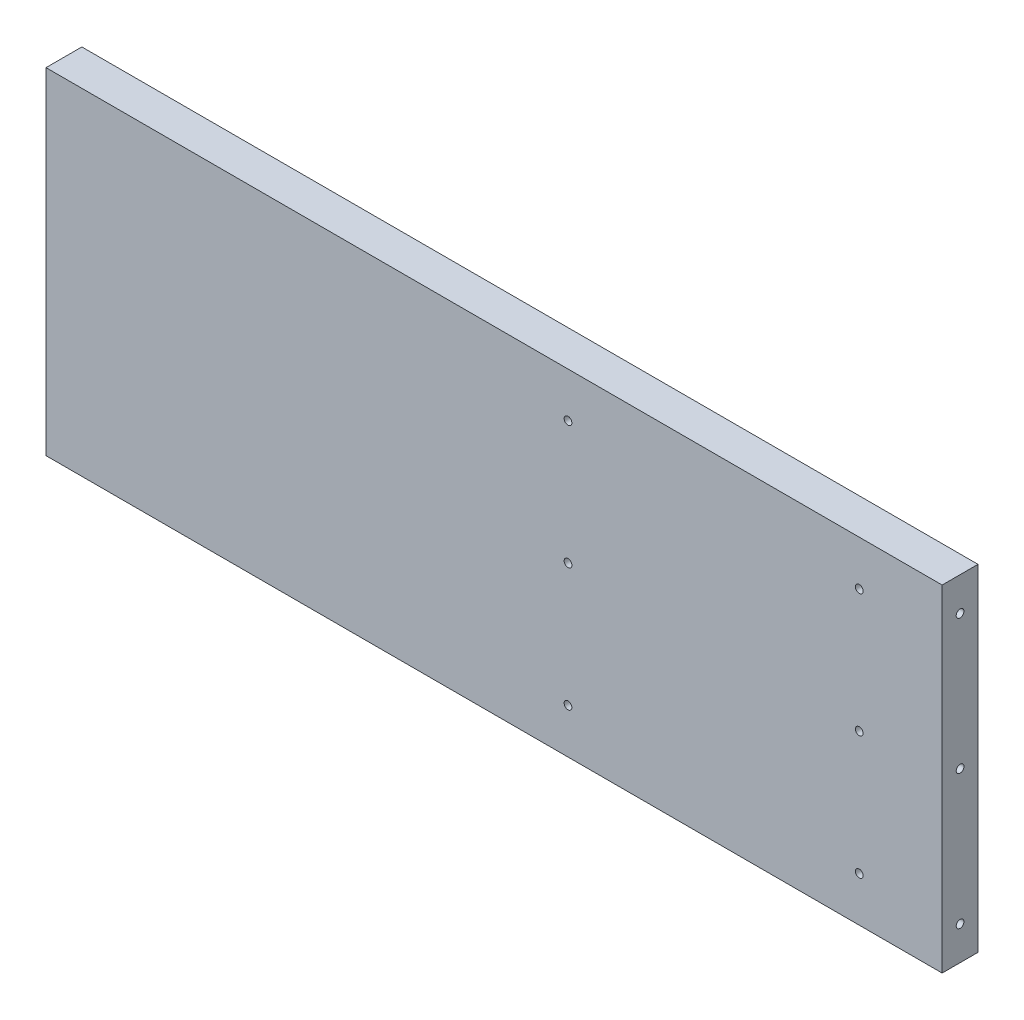
ISO-10303-21;
HEADER;
FILE_DESCRIPTION(('STEP AP214'),'2;1');
FILE_NAME('part.step','',(''),(''),'','','');
FILE_SCHEMA(('AUTOMOTIVE_DESIGN { 1 0 10303 214 1 1 1 1 }'));
ENDSEC;
DATA;
#1=APPLICATION_CONTEXT('core data for automotive mechanical design processes');
#2=APPLICATION_PROTOCOL_DEFINITION('international standard','automotive_design',2000,#1);
#3=PRODUCT_CONTEXT('',#1,'mechanical');
#4=PRODUCT('Part','Part','',(#3));
#5=PRODUCT_RELATED_PRODUCT_CATEGORY('part','',(#4));
#6=PRODUCT_DEFINITION_FORMATION('','',#4);
#7=PRODUCT_DEFINITION_CONTEXT('part definition',#1,'design');
#8=PRODUCT_DEFINITION('design','',#6,#7);
#9=PRODUCT_DEFINITION_SHAPE('','',#8);
#10=(LENGTH_UNIT() NAMED_UNIT(*) SI_UNIT(.MILLI.,.METRE.));
#11=(NAMED_UNIT(*) PLANE_ANGLE_UNIT() SI_UNIT($,.RADIAN.));
#12=(NAMED_UNIT(*) SI_UNIT($,.STERADIAN.) SOLID_ANGLE_UNIT());
#13=UNCERTAINTY_MEASURE_WITH_UNIT(LENGTH_MEASURE(1.E-05),#10,'distance_accuracy_value','');
#14=(GEOMETRIC_REPRESENTATION_CONTEXT(3) GLOBAL_UNCERTAINTY_ASSIGNED_CONTEXT((#13)) GLOBAL_UNIT_ASSIGNED_CONTEXT((#10,
#11,#12)) REPRESENTATION_CONTEXT('',''));
#15=CARTESIAN_POINT('',(0.,0.,0.));
#16=DIRECTION('',(0.,0.,1.));
#17=DIRECTION('',(1.,0.,0.));
#18=AXIS2_PLACEMENT_3D('',#15,#16,#17);
#19=CARTESIAN_POINT('',(200.,-75.,8.));
#20=DIRECTION('',(-1.,0.,0.));
#21=DIRECTION('',(0.,0.,1.));
#22=AXIS2_PLACEMENT_3D('',#19,#20,#21);
#23=PLANE('',#22);
#24=CARTESIAN_POINT('',(200.,60.,0.));
#25=DIRECTION('',(1.,0.,0.));
#26=DIRECTION('',(0.,0.,-1.));
#27=AXIS2_PLACEMENT_3D('',#24,#25,#26);
#28=CIRCLE('',#27,1.7272);
#29=CARTESIAN_POINT('',(200.,60.,-1.72720000000005));
#30=VERTEX_POINT('',#29);
#31=EDGE_CURVE('E162',#30,#30,#28,.T.);
#32=ORIENTED_EDGE('',*,*,#31,.F.);
#33=EDGE_LOOP('',(#32));
#34=FACE_BOUND('',#33,.T.);
#35=CARTESIAN_POINT('',(200.,0.,0.));
#36=DIRECTION('',(1.,0.,0.));
#37=DIRECTION('',(0.,0.,-1.));
#38=AXIS2_PLACEMENT_3D('',#35,#36,#37);
#39=CIRCLE('',#38,1.7272);
#40=CARTESIAN_POINT('',(200.,0.,-1.7272));
#41=VERTEX_POINT('',#40);
#42=EDGE_CURVE('E170',#41,#41,#39,.T.);
#43=ORIENTED_EDGE('',*,*,#42,.F.);
#44=EDGE_LOOP('',(#43));
#45=FACE_BOUND('',#44,.T.);
#46=CARTESIAN_POINT('',(200.,-59.9999999999998,0.));
#47=DIRECTION('',(1.,0.,0.));
#48=DIRECTION('',(0.,0.,-1.));
#49=AXIS2_PLACEMENT_3D('',#46,#47,#48);
#50=CIRCLE('',#49,1.7272);
#51=CARTESIAN_POINT('',(200.,-59.9999999999998,-1.72720000000005));
#52=VERTEX_POINT('',#51);
#53=EDGE_CURVE('E178',#52,#52,#50,.T.);
#54=ORIENTED_EDGE('',*,*,#53,.F.);
#55=EDGE_LOOP('',(#54));
#56=FACE_BOUND('',#55,.T.);
#57=DIRECTION('',(0.,1.,0.));
#58=VECTOR('',#57,1.);
#59=CARTESIAN_POINT('',(200.,-75.,-8.));
#60=LINE('',#59,#58);
#61=CARTESIAN_POINT('',(200.,-75.,-8.));
#62=VERTEX_POINT('',#61);
#63=CARTESIAN_POINT('',(200.,75.,-8.));
#64=VERTEX_POINT('',#63);
#65=EDGE_CURVE('E230',#62,#64,#60,.T.);
#66=ORIENTED_EDGE('',*,*,#65,.T.);
#67=DIRECTION('',(0.,0.,-1.));
#68=VECTOR('',#67,1.);
#69=CARTESIAN_POINT('',(200.,75.,8.));
#70=LINE('',#69,#68);
#71=CARTESIAN_POINT('',(200.,75.,8.));
#72=VERTEX_POINT('',#71);
#73=EDGE_CURVE('E11',#72,#64,#70,.T.);
#74=ORIENTED_EDGE('',*,*,#73,.F.);
#75=DIRECTION('',(0.,1.,0.));
#76=VECTOR('',#75,1.);
#77=CARTESIAN_POINT('',(200.,-75.,8.));
#78=LINE('',#77,#76);
#79=CARTESIAN_POINT('',(200.,-75.,8.));
#80=VERTEX_POINT('',#79);
#81=EDGE_CURVE('E231',#80,#72,#78,.T.);
#82=ORIENTED_EDGE('',*,*,#81,.F.);
#83=DIRECTION('',(0.,0.,-1.));
#84=VECTOR('',#83,1.);
#85=CARTESIAN_POINT('',(200.,-75.,8.));
#86=LINE('',#85,#84);
#87=EDGE_CURVE('E241',#80,#62,#86,.T.);
#88=ORIENTED_EDGE('',*,*,#87,.T.);
#89=EDGE_LOOP('',(#66,#74,#82,#88));
#90=FACE_BOUND('',#89,.T.);
#91=ADVANCED_FACE('F49',(#34,#45,#56,#90),#23,.F.);
#92=CARTESIAN_POINT('',(-200.,75.,8.));
#93=DIRECTION('',(0.,-1.,0.));
#94=DIRECTION('',(0.,0.,-1.));
#95=AXIS2_PLACEMENT_3D('',#92,#93,#94);
#96=PLANE('',#95);
#97=DIRECTION('',(-1.,0.,0.));
#98=VECTOR('',#97,1.);
#99=CARTESIAN_POINT('',(-200.,75.,-8.));
#100=LINE('',#99,#98);
#101=CARTESIAN_POINT('',(-200.,75.,-8.));
#102=VERTEX_POINT('',#101);
#103=EDGE_CURVE('E245',#64,#102,#100,.T.);
#104=ORIENTED_EDGE('',*,*,#103,.T.);
#105=DIRECTION('',(0.,0.,-1.));
#106=VECTOR('',#105,1.);
#107=CARTESIAN_POINT('',(-200.,75.,8.));
#108=LINE('',#107,#106);
#109=CARTESIAN_POINT('',(-200.,75.,8.));
#110=VERTEX_POINT('',#109);
#111=EDGE_CURVE('E59',#110,#102,#108,.T.);
#112=ORIENTED_EDGE('',*,*,#111,.F.);
#113=DIRECTION('',(-1.,0.,0.));
#114=VECTOR('',#113,1.);
#115=CARTESIAN_POINT('',(-200.,75.,8.));
#116=LINE('',#115,#114);
#117=EDGE_CURVE('E98',#72,#110,#116,.T.);
#118=ORIENTED_EDGE('',*,*,#117,.F.);
#119=ORIENTED_EDGE('',*,*,#73,.T.);
#120=EDGE_LOOP('',(#104,#112,#118,#119));
#121=FACE_BOUND('',#120,.T.);
#122=ADVANCED_FACE('F280',(#121),#96,.F.);
#123=CARTESIAN_POINT('',(-200.,-75.,8.));
#124=DIRECTION('',(1.,0.,0.));
#125=DIRECTION('',(0.,0.,-1.));
#126=AXIS2_PLACEMENT_3D('',#123,#124,#125);
#127=PLANE('',#126);
#128=DIRECTION('',(0.,-1.,0.));
#129=VECTOR('',#128,1.);
#130=CARTESIAN_POINT('',(-200.,-75.,-8.));
#131=LINE('',#130,#129);
#132=CARTESIAN_POINT('',(-200.,-75.,-8.));
#133=VERTEX_POINT('',#132);
#134=EDGE_CURVE('E85',#102,#133,#131,.T.);
#135=ORIENTED_EDGE('',*,*,#134,.T.);
#136=DIRECTION('',(0.,0.,-1.));
#137=VECTOR('',#136,1.);
#138=CARTESIAN_POINT('',(-200.,-75.,8.));
#139=LINE('',#138,#137);
#140=CARTESIAN_POINT('',(-200.,-75.,8.));
#141=VERTEX_POINT('',#140);
#142=EDGE_CURVE('E254',#141,#133,#139,.T.);
#143=ORIENTED_EDGE('',*,*,#142,.F.);
#144=DIRECTION('',(0.,-1.,0.));
#145=VECTOR('',#144,1.);
#146=CARTESIAN_POINT('',(-200.,-75.,8.));
#147=LINE('',#146,#145);
#148=EDGE_CURVE('E236',#110,#141,#147,.T.);
#149=ORIENTED_EDGE('',*,*,#148,.F.);
#150=ORIENTED_EDGE('',*,*,#111,.T.);
#151=EDGE_LOOP('',(#135,#143,#149,#150));
#152=FACE_BOUND('',#151,.T.);
#153=ADVANCED_FACE('F260',(#152),#127,.F.);
#154=CARTESIAN_POINT('',(-200.,-75.,8.));
#155=DIRECTION('',(0.,1.,0.));
#156=DIRECTION('',(0.,0.,1.));
#157=AXIS2_PLACEMENT_3D('',#154,#155,#156);
#158=PLANE('',#157);
#159=CARTESIAN_POINT('',(87.9999999999998,-75.,0.));
#160=DIRECTION('',(0.,-1.,0.));
#161=DIRECTION('',(0.,0.,-1.));
#162=AXIS2_PLACEMENT_3D('',#159,#160,#161);
#163=CIRCLE('',#162,1.72719999999998);
#164=CARTESIAN_POINT('',(87.9999999999998,-75.,-1.72719999999996));
#165=VERTEX_POINT('',#164);
#166=EDGE_CURVE('E132',#165,#165,#163,.T.);
#167=ORIENTED_EDGE('',*,*,#166,.F.);
#168=EDGE_LOOP('',(#167));
#169=FACE_BOUND('',#168,.T.);
#170=CARTESIAN_POINT('',(112.,-75.,0.));
#171=DIRECTION('',(0.,-1.,0.));
#172=DIRECTION('',(0.,0.,-1.));
#173=AXIS2_PLACEMENT_3D('',#170,#171,#172);
#174=CIRCLE('',#173,1.72719999999998);
#175=CARTESIAN_POINT('',(112.,-75.,-1.72719999999995));
#176=VERTEX_POINT('',#175);
#177=EDGE_CURVE('E131',#176,#176,#174,.T.);
#178=ORIENTED_EDGE('',*,*,#177,.F.);
#179=EDGE_LOOP('',(#178));
#180=FACE_BOUND('',#179,.T.);
#181=CARTESIAN_POINT('',(-88.0000000000002,-75.,0.));
#182=DIRECTION('',(0.,-1.,0.));
#183=DIRECTION('',(0.,0.,-1.));
#184=AXIS2_PLACEMENT_3D('',#181,#182,#183);
#185=CIRCLE('',#184,1.72719999999998);
#186=CARTESIAN_POINT('',(-88.0000000000002,-75.,-1.72719999999995));
#187=VERTEX_POINT('',#186);
#188=EDGE_CURVE('E146',#187,#187,#185,.T.);
#189=ORIENTED_EDGE('',*,*,#188,.F.);
#190=EDGE_LOOP('',(#189));
#191=FACE_BOUND('',#190,.T.);
#192=CARTESIAN_POINT('',(-112.,-75.,0.));
#193=DIRECTION('',(0.,-1.,0.));
#194=DIRECTION('',(0.,0.,-1.));
#195=AXIS2_PLACEMENT_3D('',#192,#193,#194);
#196=CIRCLE('',#195,1.72719999999998);
#197=CARTESIAN_POINT('',(-112.,-75.,-1.72719999999996));
#198=VERTEX_POINT('',#197);
#199=EDGE_CURVE('E154',#198,#198,#196,.T.);
#200=ORIENTED_EDGE('',*,*,#199,.F.);
#201=EDGE_LOOP('',(#200));
#202=FACE_BOUND('',#201,.T.);
#203=DIRECTION('',(1.,0.,0.));
#204=VECTOR('',#203,1.);
#205=CARTESIAN_POINT('',(-200.,-75.,-8.));
#206=LINE('',#205,#204);
#207=EDGE_CURVE('E91',#133,#62,#206,.T.);
#208=ORIENTED_EDGE('',*,*,#207,.T.);
#209=ORIENTED_EDGE('',*,*,#87,.F.);
#210=DIRECTION('',(1.,0.,0.));
#211=VECTOR('',#210,1.);
#212=CARTESIAN_POINT('',(-200.,-75.,8.));
#213=LINE('',#212,#211);
#214=EDGE_CURVE('E67',#141,#80,#213,.T.);
#215=ORIENTED_EDGE('',*,*,#214,.F.);
#216=ORIENTED_EDGE('',*,*,#142,.T.);
#217=EDGE_LOOP('',(#208,#209,#215,#216));
#218=FACE_BOUND('',#217,.T.);
#219=ADVANCED_FACE('F267',(#169,#180,#191,#202,#218),#158,.F.);
#220=CARTESIAN_POINT('',(0.,0.,8.));
#221=DIRECTION('',(0.,0.,-1.));
#222=DIRECTION('',(-1.,0.,0.));
#223=AXIS2_PLACEMENT_3D('',#220,#221,#222);
#224=PLANE('',#223);
#225=CARTESIAN_POINT('',(32.9999999999993,-55.0000000000001,8.00000000000001));
#226=DIRECTION('',(0.,0.,1.));
#227=DIRECTION('',(1.,0.,0.));
#228=AXIS2_PLACEMENT_3D('',#225,#226,#227);
#229=CIRCLE('',#228,1.7272);
#230=CARTESIAN_POINT('',(34.7271999999993,-55.0000000000001,8.00000000000001));
#231=VERTEX_POINT('',#230);
#232=EDGE_CURVE('E186',#231,#231,#229,.T.);
#233=ORIENTED_EDGE('',*,*,#232,.F.);
#234=EDGE_LOOP('',(#233));
#235=FACE_BOUND('',#234,.T.);
#236=CARTESIAN_POINT('',(163.,55.0000000000001,8.00000000000001));
#237=DIRECTION('',(0.,0.,1.));
#238=DIRECTION('',(1.,0.,0.));
#239=AXIS2_PLACEMENT_3D('',#236,#237,#238);
#240=CIRCLE('',#239,1.72719999999998);
#241=CARTESIAN_POINT('',(164.7272,55.0000000000001,8.00000000000001));
#242=VERTEX_POINT('',#241);
#243=EDGE_CURVE('E194',#242,#242,#240,.T.);
#244=ORIENTED_EDGE('',*,*,#243,.F.);
#245=EDGE_LOOP('',(#244));
#246=FACE_BOUND('',#245,.T.);
#247=CARTESIAN_POINT('',(32.9999999999993,55.0000000000001,8.00000000000001));
#248=DIRECTION('',(0.,0.,1.));
#249=DIRECTION('',(1.,0.,0.));
#250=AXIS2_PLACEMENT_3D('',#247,#248,#249);
#251=CIRCLE('',#250,1.7272);
#252=CARTESIAN_POINT('',(34.7271999999993,55.0000000000001,8.00000000000001));
#253=VERTEX_POINT('',#252);
#254=EDGE_CURVE('E202',#253,#253,#251,.T.);
#255=ORIENTED_EDGE('',*,*,#254,.F.);
#256=EDGE_LOOP('',(#255));
#257=FACE_BOUND('',#256,.T.);
#258=CARTESIAN_POINT('',(163.,-55.0000000000001,8.00000000000001));
#259=DIRECTION('',(0.,0.,1.));
#260=DIRECTION('',(1.,0.,0.));
#261=AXIS2_PLACEMENT_3D('',#258,#259,#260);
#262=CIRCLE('',#261,1.72719999999998);
#263=CARTESIAN_POINT('',(164.7272,-55.0000000000001,8.00000000000001));
#264=VERTEX_POINT('',#263);
#265=EDGE_CURVE('E206',#264,#264,#262,.T.);
#266=ORIENTED_EDGE('',*,*,#265,.F.);
#267=EDGE_LOOP('',(#266));
#268=FACE_BOUND('',#267,.T.);
#269=CARTESIAN_POINT('',(163.,0.,8.00000000000001));
#270=DIRECTION('',(0.,0.,1.));
#271=DIRECTION('',(1.,0.,0.));
#272=AXIS2_PLACEMENT_3D('',#269,#270,#271);
#273=CIRCLE('',#272,1.72719999999998);
#274=CARTESIAN_POINT('',(164.7272,0.,8.00000000000001));
#275=VERTEX_POINT('',#274);
#276=EDGE_CURVE('E214',#275,#275,#273,.T.);
#277=ORIENTED_EDGE('',*,*,#276,.F.);
#278=EDGE_LOOP('',(#277));
#279=FACE_BOUND('',#278,.T.);
#280=CARTESIAN_POINT('',(32.9999999999996,0.,8.00000000000001));
#281=DIRECTION('',(0.,0.,1.));
#282=DIRECTION('',(1.,0.,0.));
#283=AXIS2_PLACEMENT_3D('',#280,#281,#282);
#284=CIRCLE('',#283,1.7272);
#285=CARTESIAN_POINT('',(34.7271999999996,0.,8.00000000000001));
#286=VERTEX_POINT('',#285);
#287=EDGE_CURVE('E222',#286,#286,#284,.T.);
#288=ORIENTED_EDGE('',*,*,#287,.F.);
#289=EDGE_LOOP('',(#288));
#290=FACE_BOUND('',#289,.T.);
#291=ORIENTED_EDGE('',*,*,#81,.T.);
#292=ORIENTED_EDGE('',*,*,#117,.T.);
#293=ORIENTED_EDGE('',*,*,#148,.T.);
#294=ORIENTED_EDGE('',*,*,#214,.T.);
#295=EDGE_LOOP('',(#291,#292,#293,#294));
#296=FACE_BOUND('',#295,.T.);
#297=ADVANCED_FACE('F269',(#235,#246,#257,#268,#279,#290,#296),#224,.F.);
#298=CARTESIAN_POINT('',(0.,0.,-8.));
#299=DIRECTION('',(0.,0.,-1.));
#300=DIRECTION('',(-1.,0.,0.));
#301=AXIS2_PLACEMENT_3D('',#298,#299,#300);
#302=PLANE('',#301);
#303=CARTESIAN_POINT('',(32.9999999999993,-55.0000000000001,-8.));
#304=DIRECTION('',(0.,0.,-1.));
#305=DIRECTION('',(-1.,0.,0.));
#306=AXIS2_PLACEMENT_3D('',#303,#304,#305);
#307=CIRCLE('',#306,1.72719999999999);
#308=CARTESIAN_POINT('',(31.2727999999993,-55.0000000000001,-8.));
#309=VERTEX_POINT('',#308);
#310=EDGE_CURVE('E190',#309,#309,#307,.T.);
#311=ORIENTED_EDGE('',*,*,#310,.F.);
#312=EDGE_LOOP('',(#311));
#313=FACE_BOUND('',#312,.T.);
#314=CARTESIAN_POINT('',(163.,55.0000000000001,-8.));
#315=DIRECTION('',(0.,0.,-1.));
#316=DIRECTION('',(-1.,0.,0.));
#317=AXIS2_PLACEMENT_3D('',#314,#315,#316);
#318=CIRCLE('',#317,1.72719999999998);
#319=CARTESIAN_POINT('',(161.2728,55.0000000000001,-8.));
#320=VERTEX_POINT('',#319);
#321=EDGE_CURVE('E198',#320,#320,#318,.T.);
#322=ORIENTED_EDGE('',*,*,#321,.F.);
#323=EDGE_LOOP('',(#322));
#324=FACE_BOUND('',#323,.T.);
#325=CARTESIAN_POINT('',(32.9999999999993,55.0000000000001,-8.));
#326=DIRECTION('',(0.,0.,-1.));
#327=DIRECTION('',(-1.,0.,0.));
#328=AXIS2_PLACEMENT_3D('',#325,#326,#327);
#329=CIRCLE('',#328,1.72719999999999);
#330=CARTESIAN_POINT('',(31.2727999999993,55.0000000000001,-8.));
#331=VERTEX_POINT('',#330);
#332=EDGE_CURVE('E52',#331,#331,#329,.T.);
#333=ORIENTED_EDGE('',*,*,#332,.F.);
#334=EDGE_LOOP('',(#333));
#335=FACE_BOUND('',#334,.T.);
#336=CARTESIAN_POINT('',(163.,-55.0000000000001,-8.));
#337=DIRECTION('',(0.,0.,-1.));
#338=DIRECTION('',(-1.,0.,0.));
#339=AXIS2_PLACEMENT_3D('',#336,#337,#338);
#340=CIRCLE('',#339,1.72719999999998);
#341=CARTESIAN_POINT('',(161.2728,-55.0000000000001,-8.));
#342=VERTEX_POINT('',#341);
#343=EDGE_CURVE('E210',#342,#342,#340,.T.);
#344=ORIENTED_EDGE('',*,*,#343,.F.);
#345=EDGE_LOOP('',(#344));
#346=FACE_BOUND('',#345,.T.);
#347=CARTESIAN_POINT('',(163.,0.,-8.));
#348=DIRECTION('',(0.,0.,-1.));
#349=DIRECTION('',(-1.,0.,0.));
#350=AXIS2_PLACEMENT_3D('',#347,#348,#349);
#351=CIRCLE('',#350,1.72719999999998);
#352=CARTESIAN_POINT('',(161.2728,0.,-8.));
#353=VERTEX_POINT('',#352);
#354=EDGE_CURVE('E218',#353,#353,#351,.T.);
#355=ORIENTED_EDGE('',*,*,#354,.F.);
#356=EDGE_LOOP('',(#355));
#357=FACE_BOUND('',#356,.T.);
#358=CARTESIAN_POINT('',(32.9999999999996,0.,-8.));
#359=DIRECTION('',(0.,0.,-1.));
#360=DIRECTION('',(-1.,0.,0.));
#361=AXIS2_PLACEMENT_3D('',#358,#359,#360);
#362=CIRCLE('',#361,1.72719999999999);
#363=CARTESIAN_POINT('',(31.2727999999996,0.,-8.));
#364=VERTEX_POINT('',#363);
#365=EDGE_CURVE('E226',#364,#364,#362,.T.);
#366=ORIENTED_EDGE('',*,*,#365,.F.);
#367=EDGE_LOOP('',(#366));
#368=FACE_BOUND('',#367,.T.);
#369=ORIENTED_EDGE('',*,*,#65,.F.);
#370=ORIENTED_EDGE('',*,*,#207,.F.);
#371=ORIENTED_EDGE('',*,*,#134,.F.);
#372=ORIENTED_EDGE('',*,*,#103,.F.);
#373=EDGE_LOOP('',(#369,#370,#371,#372));
#374=FACE_BOUND('',#373,.T.);
#375=ADVANCED_FACE('F263',(#313,#324,#335,#346,#357,#368,#374),#302,.T.);
#376=CARTESIAN_POINT('',(32.9999999999996,0.,8.00000000000001));
#377=DIRECTION('',(0.,0.,1.));
#378=DIRECTION('',(1.,0.,0.));
#379=AXIS2_PLACEMENT_3D('',#376,#377,#378);
#380=CYLINDRICAL_SURFACE('',#379,1.72719999999999);
#381=ORIENTED_EDGE('',*,*,#365,.T.);
#382=EDGE_LOOP('',(#381));
#383=FACE_BOUND('',#382,.T.);
#384=ORIENTED_EDGE('',*,*,#287,.T.);
#385=EDGE_LOOP('',(#384));
#386=FACE_BOUND('',#385,.T.);
#387=ADVANCED_FACE('F335',(#383,#386),#380,.F.);
#388=CARTESIAN_POINT('',(163.,0.,8.00000000000001));
#389=DIRECTION('',(0.,0.,1.));
#390=DIRECTION('',(1.,0.,0.));
#391=AXIS2_PLACEMENT_3D('',#388,#389,#390);
#392=CYLINDRICAL_SURFACE('',#391,1.72719999999998);
#393=ORIENTED_EDGE('',*,*,#354,.T.);
#394=EDGE_LOOP('',(#393));
#395=FACE_BOUND('',#394,.T.);
#396=ORIENTED_EDGE('',*,*,#276,.T.);
#397=EDGE_LOOP('',(#396));
#398=FACE_BOUND('',#397,.T.);
#399=ADVANCED_FACE('F331',(#395,#398),#392,.F.);
#400=CARTESIAN_POINT('',(163.,-55.0000000000001,8.00000000000001));
#401=DIRECTION('',(0.,0.,1.));
#402=DIRECTION('',(1.,0.,0.));
#403=AXIS2_PLACEMENT_3D('',#400,#401,#402);
#404=CYLINDRICAL_SURFACE('',#403,1.72719999999998);
#405=ORIENTED_EDGE('',*,*,#343,.T.);
#406=EDGE_LOOP('',(#405));
#407=FACE_BOUND('',#406,.T.);
#408=ORIENTED_EDGE('',*,*,#265,.T.);
#409=EDGE_LOOP('',(#408));
#410=FACE_BOUND('',#409,.T.);
#411=ADVANCED_FACE('F327',(#407,#410),#404,.F.);
#412=CARTESIAN_POINT('',(32.9999999999993,55.0000000000001,8.00000000000001));
#413=DIRECTION('',(0.,0.,1.));
#414=DIRECTION('',(1.,0.,0.));
#415=AXIS2_PLACEMENT_3D('',#412,#413,#414);
#416=CYLINDRICAL_SURFACE('',#415,1.72719999999999);
#417=ORIENTED_EDGE('',*,*,#332,.T.);
#418=EDGE_LOOP('',(#417));
#419=FACE_BOUND('',#418,.T.);
#420=ORIENTED_EDGE('',*,*,#254,.T.);
#421=EDGE_LOOP('',(#420));
#422=FACE_BOUND('',#421,.T.);
#423=ADVANCED_FACE('F323',(#419,#422),#416,.F.);
#424=CARTESIAN_POINT('',(163.,55.0000000000001,8.00000000000001));
#425=DIRECTION('',(0.,0.,1.));
#426=DIRECTION('',(1.,0.,0.));
#427=AXIS2_PLACEMENT_3D('',#424,#425,#426);
#428=CYLINDRICAL_SURFACE('',#427,1.72719999999998);
#429=ORIENTED_EDGE('',*,*,#321,.T.);
#430=EDGE_LOOP('',(#429));
#431=FACE_BOUND('',#430,.T.);
#432=ORIENTED_EDGE('',*,*,#243,.T.);
#433=EDGE_LOOP('',(#432));
#434=FACE_BOUND('',#433,.T.);
#435=ADVANCED_FACE('F319',(#431,#434),#428,.F.);
#436=CARTESIAN_POINT('',(32.9999999999993,-55.0000000000001,8.00000000000001));
#437=DIRECTION('',(0.,0.,1.));
#438=DIRECTION('',(1.,0.,0.));
#439=AXIS2_PLACEMENT_3D('',#436,#437,#438);
#440=CYLINDRICAL_SURFACE('',#439,1.72719999999999);
#441=ORIENTED_EDGE('',*,*,#310,.T.);
#442=EDGE_LOOP('',(#441));
#443=FACE_BOUND('',#442,.T.);
#444=ORIENTED_EDGE('',*,*,#232,.T.);
#445=EDGE_LOOP('',(#444));
#446=FACE_BOUND('',#445,.T.);
#447=ADVANCED_FACE('F311',(#443,#446),#440,.F.);
#448=CARTESIAN_POINT('',(175.,-59.9999999999998,0.));
#449=DIRECTION('',(1.,0.,0.));
#450=DIRECTION('',(0.,0.,-1.));
#451=AXIS2_PLACEMENT_3D('',#448,#449,#450);
#452=CONICAL_SURFACE('',#451,1.72719999999999,1.02974425867665);
#453=CARTESIAN_POINT('',(173.962193538815,-59.9999999999999,0.));
#454=VERTEX_POINT('',#453);
#455=VERTEX_LOOP('',#454);
#456=FACE_BOUND('',#455,.T.);
#457=CARTESIAN_POINT('',(175.,-59.9999999999998,0.));
#458=DIRECTION('',(1.,0.,0.));
#459=DIRECTION('',(0.,0.,-1.));
#460=AXIS2_PLACEMENT_3D('',#457,#458,#459);
#461=CIRCLE('',#460,1.72719999999999);
#462=CARTESIAN_POINT('',(175.,-59.9999999999998,-1.72720000000005));
#463=VERTEX_POINT('',#462);
#464=EDGE_CURVE('E182',#463,#463,#461,.T.);
#465=ORIENTED_EDGE('',*,*,#464,.T.);
#466=EDGE_LOOP('',(#465));
#467=FACE_BOUND('',#466,.T.);
#468=ADVANCED_FACE('F301',(#456,#467),#452,.F.);
#469=CARTESIAN_POINT('',(200.,-59.9999999999998,0.));
#470=DIRECTION('',(1.,0.,0.));
#471=DIRECTION('',(0.,0.,-1.));
#472=AXIS2_PLACEMENT_3D('',#469,#470,#471);
#473=CYLINDRICAL_SURFACE('',#472,1.72719999999999);
#474=ORIENTED_EDGE('',*,*,#464,.F.);
#475=EDGE_LOOP('',(#474));
#476=FACE_BOUND('',#475,.T.);
#477=ORIENTED_EDGE('',*,*,#53,.T.);
#478=EDGE_LOOP('',(#477));
#479=FACE_BOUND('',#478,.T.);
#480=ADVANCED_FACE('F298',(#476,#479),#473,.F.);
#481=CARTESIAN_POINT('',(175.,0.,0.));
#482=DIRECTION('',(1.,0.,0.));
#483=DIRECTION('',(0.,0.,-1.));
#484=AXIS2_PLACEMENT_3D('',#481,#482,#483);
#485=CONICAL_SURFACE('',#484,1.72719999999999,1.02974425867665);
#486=CARTESIAN_POINT('',(173.962193538815,0.,0.));
#487=VERTEX_POINT('',#486);
#488=VERTEX_LOOP('',#487);
#489=FACE_BOUND('',#488,.T.);
#490=CARTESIAN_POINT('',(175.,0.,0.));
#491=DIRECTION('',(1.,0.,0.));
#492=DIRECTION('',(0.,0.,-1.));
#493=AXIS2_PLACEMENT_3D('',#490,#491,#492);
#494=CIRCLE('',#493,1.72719999999999);
#495=CARTESIAN_POINT('',(175.,0.,-1.72719999999999));
#496=VERTEX_POINT('',#495);
#497=EDGE_CURVE('E174',#496,#496,#494,.T.);
#498=ORIENTED_EDGE('',*,*,#497,.T.);
#499=EDGE_LOOP('',(#498));
#500=FACE_BOUND('',#499,.T.);
#501=ADVANCED_FACE('F300',(#489,#500),#485,.F.);
#502=CARTESIAN_POINT('',(200.,0.,0.));
#503=DIRECTION('',(1.,0.,0.));
#504=DIRECTION('',(0.,0.,-1.));
#505=AXIS2_PLACEMENT_3D('',#502,#503,#504);
#506=CYLINDRICAL_SURFACE('',#505,1.7272);
#507=ORIENTED_EDGE('',*,*,#497,.F.);
#508=EDGE_LOOP('',(#507));
#509=FACE_BOUND('',#508,.T.);
#510=ORIENTED_EDGE('',*,*,#42,.T.);
#511=EDGE_LOOP('',(#510));
#512=FACE_BOUND('',#511,.T.);
#513=ADVANCED_FACE('F307',(#509,#512),#506,.F.);
#514=CARTESIAN_POINT('',(175.,60.,0.));
#515=DIRECTION('',(1.,0.,0.));
#516=DIRECTION('',(0.,0.,-1.));
#517=AXIS2_PLACEMENT_3D('',#514,#515,#516);
#518=CONICAL_SURFACE('',#517,1.72719999999999,1.02974425867665);
#519=CARTESIAN_POINT('',(173.962193538815,60.,0.));
#520=VERTEX_POINT('',#519);
#521=VERTEX_LOOP('',#520);
#522=FACE_BOUND('',#521,.T.);
#523=CARTESIAN_POINT('',(175.,60.,0.));
#524=DIRECTION('',(1.,0.,0.));
#525=DIRECTION('',(0.,0.,-1.));
#526=AXIS2_PLACEMENT_3D('',#523,#524,#525);
#527=CIRCLE('',#526,1.72719999999999);
#528=CARTESIAN_POINT('',(175.,60.,-1.72720000000005));
#529=VERTEX_POINT('',#528);
#530=EDGE_CURVE('E166',#529,#529,#527,.T.);
#531=ORIENTED_EDGE('',*,*,#530,.T.);
#532=EDGE_LOOP('',(#531));
#533=FACE_BOUND('',#532,.T.);
#534=ADVANCED_FACE('F502',(#522,#533),#518,.F.);
#535=CARTESIAN_POINT('',(200.,60.,0.));
#536=DIRECTION('',(1.,0.,0.));
#537=DIRECTION('',(0.,0.,-1.));
#538=AXIS2_PLACEMENT_3D('',#535,#536,#537);
#539=CYLINDRICAL_SURFACE('',#538,1.72719999999999);
#540=ORIENTED_EDGE('',*,*,#530,.F.);
#541=EDGE_LOOP('',(#540));
#542=FACE_BOUND('',#541,.T.);
#543=ORIENTED_EDGE('',*,*,#31,.T.);
#544=EDGE_LOOP('',(#543));
#545=FACE_BOUND('',#544,.T.);
#546=ADVANCED_FACE('F512',(#542,#545),#539,.F.);
#547=CARTESIAN_POINT('',(-112.,-50.,0.));
#548=DIRECTION('',(0.,-1.,0.));
#549=DIRECTION('',(0.,0.,-1.));
#550=AXIS2_PLACEMENT_3D('',#547,#548,#549);
#551=CONICAL_SURFACE('',#550,1.72719999999998,1.02974425867665);
#552=CARTESIAN_POINT('',(-112.,-48.9621935388156,0.));
#553=VERTEX_POINT('',#552);
#554=VERTEX_LOOP('',#553);
#555=FACE_BOUND('',#554,.T.);
#556=CARTESIAN_POINT('',(-112.,-50.,0.));
#557=DIRECTION('',(0.,-1.,0.));
#558=DIRECTION('',(0.,0.,-1.));
#559=AXIS2_PLACEMENT_3D('',#556,#557,#558);
#560=CIRCLE('',#559,1.72719999999998);
#561=CARTESIAN_POINT('',(-112.,-50.,-1.72719999999996));
#562=VERTEX_POINT('',#561);
#563=EDGE_CURVE('E158',#562,#562,#560,.T.);
#564=ORIENTED_EDGE('',*,*,#563,.T.);
#565=EDGE_LOOP('',(#564));
#566=FACE_BOUND('',#565,.T.);
#567=ADVANCED_FACE('F522',(#555,#566),#551,.F.);
#568=CARTESIAN_POINT('',(-112.,-75.,0.));
#569=DIRECTION('',(0.,-1.,0.));
#570=DIRECTION('',(0.,0.,-1.));
#571=AXIS2_PLACEMENT_3D('',#568,#569,#570);
#572=CYLINDRICAL_SURFACE('',#571,1.72719999999998);
#573=ORIENTED_EDGE('',*,*,#563,.F.);
#574=EDGE_LOOP('',(#573));
#575=FACE_BOUND('',#574,.T.);
#576=ORIENTED_EDGE('',*,*,#199,.T.);
#577=EDGE_LOOP('',(#576));
#578=FACE_BOUND('',#577,.T.);
#579=ADVANCED_FACE('F533',(#575,#578),#572,.F.);
#580=CARTESIAN_POINT('',(-88.0000000000002,-50.,0.));
#581=DIRECTION('',(0.,-1.,0.));
#582=DIRECTION('',(0.,0.,-1.));
#583=AXIS2_PLACEMENT_3D('',#580,#581,#582);
#584=CONICAL_SURFACE('',#583,1.72719999999998,1.02974425867665);
#585=CARTESIAN_POINT('',(-88.0000000000002,-48.9621935388156,0.));
#586=VERTEX_POINT('',#585);
#587=VERTEX_LOOP('',#586);
#588=FACE_BOUND('',#587,.T.);
#589=CARTESIAN_POINT('',(-88.0000000000002,-50.,0.));
#590=DIRECTION('',(0.,-1.,0.));
#591=DIRECTION('',(0.,0.,-1.));
#592=AXIS2_PLACEMENT_3D('',#589,#590,#591);
#593=CIRCLE('',#592,1.72719999999998);
#594=CARTESIAN_POINT('',(-88.0000000000002,-50.,-1.72719999999995));
#595=VERTEX_POINT('',#594);
#596=EDGE_CURVE('E150',#595,#595,#593,.T.);
#597=ORIENTED_EDGE('',*,*,#596,.T.);
#598=EDGE_LOOP('',(#597));
#599=FACE_BOUND('',#598,.T.);
#600=ADVANCED_FACE('F543',(#588,#599),#584,.F.);
#601=CARTESIAN_POINT('',(-88.0000000000002,-75.,0.));
#602=DIRECTION('',(0.,-1.,0.));
#603=DIRECTION('',(0.,0.,-1.));
#604=AXIS2_PLACEMENT_3D('',#601,#602,#603);
#605=CYLINDRICAL_SURFACE('',#604,1.72719999999998);
#606=ORIENTED_EDGE('',*,*,#596,.F.);
#607=EDGE_LOOP('',(#606));
#608=FACE_BOUND('',#607,.T.);
#609=ORIENTED_EDGE('',*,*,#188,.T.);
#610=EDGE_LOOP('',(#609));
#611=FACE_BOUND('',#610,.T.);
#612=ADVANCED_FACE('F555',(#608,#611),#605,.F.);
#613=CARTESIAN_POINT('',(112.,-50.,0.));
#614=DIRECTION('',(0.,-1.,0.));
#615=DIRECTION('',(0.,0.,-1.));
#616=AXIS2_PLACEMENT_3D('',#613,#614,#615);
#617=CONICAL_SURFACE('',#616,1.72719999999998,1.02974425867665);
#618=CARTESIAN_POINT('',(112.,-48.9621935388156,0.));
#619=VERTEX_POINT('',#618);
#620=VERTEX_LOOP('',#619);
#621=FACE_BOUND('',#620,.T.);
#622=CARTESIAN_POINT('',(112.,-50.,0.));
#623=DIRECTION('',(0.,-1.,0.));
#624=DIRECTION('',(0.,0.,-1.));
#625=AXIS2_PLACEMENT_3D('',#622,#623,#624);
#626=CIRCLE('',#625,1.72719999999998);
#627=CARTESIAN_POINT('',(112.,-50.,-1.72719999999995));
#628=VERTEX_POINT('',#627);
#629=EDGE_CURVE('E138',#628,#628,#626,.T.);
#630=ORIENTED_EDGE('',*,*,#629,.T.);
#631=EDGE_LOOP('',(#630));
#632=FACE_BOUND('',#631,.T.);
#633=ADVANCED_FACE('F565',(#621,#632),#617,.F.);
#634=CARTESIAN_POINT('',(112.,-75.,0.));
#635=DIRECTION('',(0.,-1.,0.));
#636=DIRECTION('',(0.,0.,-1.));
#637=AXIS2_PLACEMENT_3D('',#634,#635,#636);
#638=CYLINDRICAL_SURFACE('',#637,1.72719999999998);
#639=ORIENTED_EDGE('',*,*,#629,.F.);
#640=EDGE_LOOP('',(#639));
#641=FACE_BOUND('',#640,.T.);
#642=ORIENTED_EDGE('',*,*,#177,.T.);
#643=EDGE_LOOP('',(#642));
#644=FACE_BOUND('',#643,.T.);
#645=ADVANCED_FACE('F124',(#641,#644),#638,.F.);
#646=CARTESIAN_POINT('',(87.9999999999998,-50.,0.));
#647=DIRECTION('',(0.,-1.,0.));
#648=DIRECTION('',(0.,0.,-1.));
#649=AXIS2_PLACEMENT_3D('',#646,#647,#648);
#650=CONICAL_SURFACE('',#649,1.72719999999998,1.02974425867665);
#651=CARTESIAN_POINT('',(87.9999999999998,-48.9621935388156,0.));
#652=VERTEX_POINT('',#651);
#653=VERTEX_LOOP('',#652);
#654=FACE_BOUND('',#653,.T.);
#655=CARTESIAN_POINT('',(87.9999999999998,-50.,0.));
#656=DIRECTION('',(0.,-1.,0.));
#657=DIRECTION('',(0.,0.,-1.));
#658=AXIS2_PLACEMENT_3D('',#655,#656,#657);
#659=CIRCLE('',#658,1.72719999999998);
#660=CARTESIAN_POINT('',(87.9999999999998,-50.,-1.72719999999996));
#661=VERTEX_POINT('',#660);
#662=EDGE_CURVE('E128',#661,#661,#659,.T.);
#663=ORIENTED_EDGE('',*,*,#662,.T.);
#664=EDGE_LOOP('',(#663));
#665=FACE_BOUND('',#664,.T.);
#666=ADVANCED_FACE('F120',(#654,#665),#650,.F.);
#667=CARTESIAN_POINT('',(87.9999999999998,-75.,0.));
#668=DIRECTION('',(0.,-1.,0.));
#669=DIRECTION('',(0.,0.,-1.));
#670=AXIS2_PLACEMENT_3D('',#667,#668,#669);
#671=CYLINDRICAL_SURFACE('',#670,1.72719999999998);
#672=ORIENTED_EDGE('',*,*,#662,.F.);
#673=EDGE_LOOP('',(#672));
#674=FACE_BOUND('',#673,.T.);
#675=ORIENTED_EDGE('',*,*,#166,.T.);
#676=EDGE_LOOP('',(#675));
#677=FACE_BOUND('',#676,.T.);
#678=ADVANCED_FACE('F123',(#674,#677),#671,.F.);
#679=CLOSED_SHELL('',(#91,#122,#153,#219,#297,#375,#387,#399,#411,#423,#435,#447,#468,#480,#501,
#513,#534,#546,#567,#579,#600,#612,#633,#645,#666,#678));
#680=MANIFOLD_SOLID_BREP('B2',#679);
#681=ADVANCED_BREP_SHAPE_REPRESENTATION('',(#18,#680),#14);
#682=SHAPE_DEFINITION_REPRESENTATION(#9,#681);
ENDSEC;
END-ISO-10303-21;
